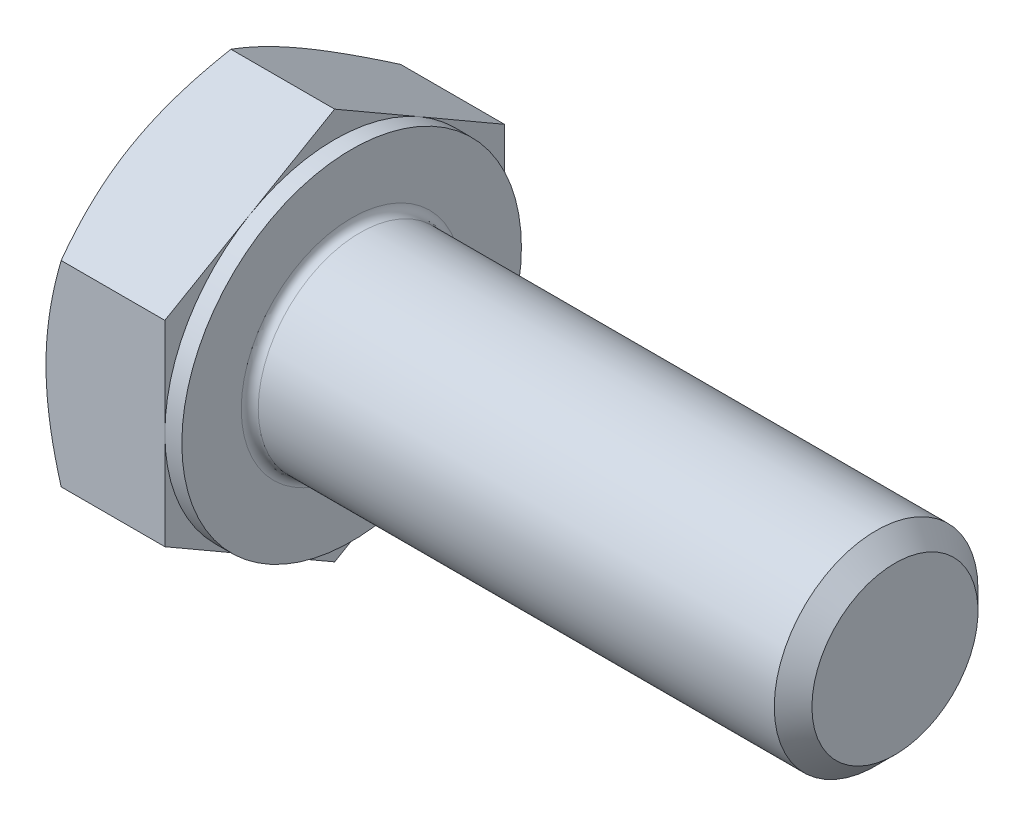
ISO-10303-21;
HEADER;
FILE_DESCRIPTION(('STEP AP214'),'2;1');
FILE_NAME('part.step','',(''),(''),'','','');
FILE_SCHEMA(('AUTOMOTIVE_DESIGN { 1 0 10303 214 1 1 1 1 }'));
ENDSEC;
DATA;
#1=APPLICATION_CONTEXT('core data for automotive mechanical design processes');
#2=APPLICATION_PROTOCOL_DEFINITION('international standard','automotive_design',2000,#1);
#3=PRODUCT_CONTEXT('',#1,'mechanical');
#4=PRODUCT('Part','Part','',(#3));
#5=PRODUCT_RELATED_PRODUCT_CATEGORY('part','',(#4));
#6=PRODUCT_DEFINITION_FORMATION('','',#4);
#7=PRODUCT_DEFINITION_CONTEXT('part definition',#1,'design');
#8=PRODUCT_DEFINITION('design','',#6,#7);
#9=PRODUCT_DEFINITION_SHAPE('','',#8);
#10=(LENGTH_UNIT() NAMED_UNIT(*) SI_UNIT(.MILLI.,.METRE.));
#11=(NAMED_UNIT(*) PLANE_ANGLE_UNIT() SI_UNIT($,.RADIAN.));
#12=(NAMED_UNIT(*) SI_UNIT($,.STERADIAN.) SOLID_ANGLE_UNIT());
#13=UNCERTAINTY_MEASURE_WITH_UNIT(LENGTH_MEASURE(1.E-05),#10,'distance_accuracy_value','');
#14=(GEOMETRIC_REPRESENTATION_CONTEXT(3) GLOBAL_UNCERTAINTY_ASSIGNED_CONTEXT((#13)) GLOBAL_UNIT_ASSIGNED_CONTEXT((#10,
#11,#12)) REPRESENTATION_CONTEXT('',''));
#15=CARTESIAN_POINT('',(0.,0.,0.));
#16=DIRECTION('',(0.,0.,1.));
#17=DIRECTION('',(1.,0.,0.));
#18=AXIS2_PLACEMENT_3D('',#15,#16,#17);
#19=CARTESIAN_POINT('',(4.,0.,-9.99999999999999));
#20=DIRECTION('',(1.,0.,0.));
#21=DIRECTION('',(0.,0.,-1.));
#22=AXIS2_PLACEMENT_3D('',#19,#20,#21);
#23=PLANE('',#22);
#24=CARTESIAN_POINT('',(4.,0.,0.));
#25=DIRECTION('',(1.,0.,0.));
#26=DIRECTION('',(0.,0.,-1.));
#27=AXIS2_PLACEMENT_3D('',#24,#25,#26);
#28=CIRCLE('',#27,3.25);
#29=CARTESIAN_POINT('',(4.,0.,-3.25));
#30=VERTEX_POINT('',#29);
#31=EDGE_CURVE('E43',#30,#30,#28,.F.);
#32=ORIENTED_EDGE('',*,*,#31,.T.);
#33=EDGE_LOOP('',(#32));
#34=FACE_BOUND('',#33,.T.);
#35=CARTESIAN_POINT('',(4.,0.,0.));
#36=DIRECTION('',(1.,0.,0.));
#37=DIRECTION('',(0.,0.,-1.));
#38=AXIS2_PLACEMENT_3D('',#35,#36,#37);
#39=CIRCLE('',#38,5.);
#40=CARTESIAN_POINT('',(4.,0.,-5.));
#41=VERTEX_POINT('',#40);
#42=EDGE_CURVE('E256',#41,#41,#39,.T.);
#43=ORIENTED_EDGE('',*,*,#42,.T.);
#44=EDGE_LOOP('',(#43));
#45=FACE_BOUND('',#44,.T.);
#46=ADVANCED_FACE('F34',(#34,#45),#23,.T.);
#47=CARTESIAN_POINT('',(0.,0.,0.));
#48=DIRECTION('',(-1.,0.,0.));
#49=DIRECTION('',(0.,0.,1.));
#50=AXIS2_PLACEMENT_3D('',#47,#48,#49);
#51=CYLINDRICAL_SURFACE('',#50,3.);
#52=CARTESIAN_POINT('',(4.25,0.,0.));
#53=DIRECTION('',(1.,0.,0.));
#54=DIRECTION('',(0.,0.,-1.));
#55=AXIS2_PLACEMENT_3D('',#52,#53,#54);
#56=CIRCLE('',#55,3.);
#57=CARTESIAN_POINT('',(4.25,0.,-3.));
#58=VERTEX_POINT('',#57);
#59=EDGE_CURVE('E11',#58,#58,#56,.T.);
#60=ORIENTED_EDGE('',*,*,#59,.T.);
#61=EDGE_LOOP('',(#60));
#62=FACE_BOUND('',#61,.T.);
#63=CARTESIAN_POINT('',(19.4455,0.,0.));
#64=DIRECTION('',(-1.,0.,0.));
#65=DIRECTION('',(0.,0.,1.));
#66=AXIS2_PLACEMENT_3D('',#63,#64,#65);
#67=CIRCLE('',#66,3.);
#68=CARTESIAN_POINT('',(19.4455,0.,3.));
#69=VERTEX_POINT('',#68);
#70=EDGE_CURVE('E300',#69,#69,#67,.T.);
#71=ORIENTED_EDGE('',*,*,#70,.T.);
#72=EDGE_LOOP('',(#71));
#73=FACE_BOUND('',#72,.T.);
#74=ADVANCED_FACE('F243',(#62,#73),#51,.T.);
#75=CARTESIAN_POINT('',(20.,0.,0.));
#76=DIRECTION('',(-1.,0.,0.));
#77=DIRECTION('',(0.,0.,1.));
#78=AXIS2_PLACEMENT_3D('',#75,#76,#77);
#79=CONICAL_SURFACE('',#78,2.4455,0.785398163397449);
#80=ORIENTED_EDGE('',*,*,#70,.F.);
#81=EDGE_LOOP('',(#80));
#82=FACE_BOUND('',#81,.T.);
#83=CARTESIAN_POINT('',(20.,0.,0.));
#84=DIRECTION('',(-1.,0.,0.));
#85=DIRECTION('',(0.,0.,1.));
#86=AXIS2_PLACEMENT_3D('',#83,#84,#85);
#87=CIRCLE('',#86,2.4455);
#88=CARTESIAN_POINT('',(20.,0.,2.4455));
#89=VERTEX_POINT('',#88);
#90=EDGE_CURVE('E302',#89,#89,#87,.T.);
#91=ORIENTED_EDGE('',*,*,#90,.T.);
#92=EDGE_LOOP('',(#91));
#93=FACE_BOUND('',#92,.T.);
#94=ADVANCED_FACE('F248',(#82,#93),#79,.T.);
#95=CARTESIAN_POINT('',(20.,0.,0.));
#96=DIRECTION('',(-1.,0.,0.));
#97=DIRECTION('',(0.,0.,1.));
#98=AXIS2_PLACEMENT_3D('',#95,#96,#97);
#99=PLANE('',#98);
#100=ORIENTED_EDGE('',*,*,#90,.F.);
#101=EDGE_LOOP('',(#100));
#102=FACE_BOUND('',#101,.T.);
#103=ADVANCED_FACE('F349',(#102),#99,.F.);
#104=CARTESIAN_POINT('',(3.5,5.,0.));
#105=DIRECTION('',(1.,0.,0.));
#106=DIRECTION('',(0.,0.,-1.));
#107=AXIS2_PLACEMENT_3D('',#104,#105,#106);
#108=PLANE('',#107);
#109=DIRECTION('',(0.,0.500000000000001,0.866025403784438));
#110=VECTOR('',#109,1.);
#111=CARTESIAN_POINT('',(3.5,2.88675134594813,-5.));
#112=LINE('',#111,#110);
#113=CARTESIAN_POINT('',(3.5,2.88675134594813,-5.));
#114=VERTEX_POINT('',#113);
#115=CARTESIAN_POINT('',(3.5,4.33012701892219,-2.50000000000001));
#116=VERTEX_POINT('',#115);
#117=EDGE_CURVE('E167',#114,#116,#112,.T.);
#118=ORIENTED_EDGE('',*,*,#117,.T.);
#119=CARTESIAN_POINT('',(3.5,0.,0.));
#120=DIRECTION('',(-1.,0.,0.));
#121=DIRECTION('',(0.,0.,1.));
#122=AXIS2_PLACEMENT_3D('',#119,#120,#121);
#123=CIRCLE('',#122,5.);
#124=CARTESIAN_POINT('',(3.5,0.,-5.));
#125=VERTEX_POINT('',#124);
#126=EDGE_CURVE('E50',#116,#125,#123,.T.);
#127=ORIENTED_EDGE('',*,*,#126,.T.);
#128=DIRECTION('',(0.,1.,0.));
#129=VECTOR('',#128,1.);
#130=CARTESIAN_POINT('',(3.5,2.88675134594813,-5.));
#131=LINE('',#130,#129);
#132=EDGE_CURVE('E257',#125,#114,#131,.T.);
#133=ORIENTED_EDGE('',*,*,#132,.T.);
#134=EDGE_LOOP('',(#118,#127,#133));
#135=FACE_BOUND('',#134,.T.);
#136=ADVANCED_FACE('F279',(#135),#108,.T.);
#137=CARTESIAN_POINT('',(3.5,5.77350269189626,0.));
#138=VERTEX_POINT('',#137);
#139=EDGE_CURVE('E165',#116,#138,#112,.T.);
#140=ORIENTED_EDGE('',*,*,#139,.T.);
#141=DIRECTION('',(0.,-0.500000000000001,0.866025403784438));
#142=VECTOR('',#141,1.);
#143=CARTESIAN_POINT('',(3.5,5.77350269189626,0.));
#144=LINE('',#143,#142);
#145=CARTESIAN_POINT('',(3.5,4.33012701892219,2.50000000000001));
#146=VERTEX_POINT('',#145);
#147=EDGE_CURVE('E164',#138,#146,#144,.T.);
#148=ORIENTED_EDGE('',*,*,#147,.T.);
#149=EDGE_CURVE('E153',#146,#116,#123,.T.);
#150=ORIENTED_EDGE('',*,*,#149,.T.);
#151=EDGE_LOOP('',(#140,#148,#150));
#152=FACE_BOUND('',#151,.T.);
#153=ADVANCED_FACE('F286',(#152),#108,.T.);
#154=CARTESIAN_POINT('',(3.5,2.88675134594813,5.));
#155=VERTEX_POINT('',#154);
#156=EDGE_CURVE('E132',#146,#155,#144,.T.);
#157=ORIENTED_EDGE('',*,*,#156,.T.);
#158=DIRECTION('',(0.,-1.,0.));
#159=VECTOR('',#158,1.);
#160=CARTESIAN_POINT('',(3.5,2.88675134594813,5.));
#161=LINE('',#160,#159);
#162=CARTESIAN_POINT('',(3.5,0.,5.));
#163=VERTEX_POINT('',#162);
#164=EDGE_CURVE('E126',#155,#163,#161,.T.);
#165=ORIENTED_EDGE('',*,*,#164,.T.);
#166=EDGE_CURVE('E130',#163,#146,#123,.T.);
#167=ORIENTED_EDGE('',*,*,#166,.T.);
#168=EDGE_LOOP('',(#157,#165,#167));
#169=FACE_BOUND('',#168,.T.);
#170=ADVANCED_FACE('F128',(#169),#108,.T.);
#171=CARTESIAN_POINT('',(3.5,-2.88675134594814,5.));
#172=VERTEX_POINT('',#171);
#173=EDGE_CURVE('E136',#163,#172,#161,.T.);
#174=ORIENTED_EDGE('',*,*,#173,.T.);
#175=DIRECTION('',(0.,-0.500000000000001,-0.866025403784438));
#176=VECTOR('',#175,1.);
#177=CARTESIAN_POINT('',(3.5,-5.77350269189627,0.));
#178=LINE('',#177,#176);
#179=CARTESIAN_POINT('',(3.5,-4.33012701892219,2.50000000000001));
#180=VERTEX_POINT('',#179);
#181=EDGE_CURVE('E143',#172,#180,#178,.T.);
#182=ORIENTED_EDGE('',*,*,#181,.T.);
#183=EDGE_CURVE('E140',#180,#163,#123,.T.);
#184=ORIENTED_EDGE('',*,*,#183,.T.);
#185=EDGE_LOOP('',(#174,#182,#184));
#186=FACE_BOUND('',#185,.T.);
#187=ADVANCED_FACE('F141',(#186),#108,.T.);
#188=CARTESIAN_POINT('',(3.5,-5.77350269189627,0.));
#189=VERTEX_POINT('',#188);
#190=EDGE_CURVE('E159',#180,#189,#178,.T.);
#191=ORIENTED_EDGE('',*,*,#190,.T.);
#192=DIRECTION('',(0.,0.500000000000001,-0.866025403784438));
#193=VECTOR('',#192,1.);
#194=CARTESIAN_POINT('',(3.5,-2.88675134594814,-5.));
#195=LINE('',#194,#193);
#196=CARTESIAN_POINT('',(3.5,-4.33012701892219,-2.50000000000001));
#197=VERTEX_POINT('',#196);
#198=EDGE_CURVE('E340',#189,#197,#195,.T.);
#199=ORIENTED_EDGE('',*,*,#198,.T.);
#200=EDGE_CURVE('E147',#197,#180,#123,.T.);
#201=ORIENTED_EDGE('',*,*,#200,.T.);
#202=EDGE_LOOP('',(#191,#199,#201));
#203=FACE_BOUND('',#202,.T.);
#204=ADVANCED_FACE('F341',(#203),#108,.T.);
#205=CARTESIAN_POINT('',(3.5,-2.88675134594814,-5.));
#206=VERTEX_POINT('',#205);
#207=EDGE_CURVE('E154',#197,#206,#195,.T.);
#208=ORIENTED_EDGE('',*,*,#207,.T.);
#209=EDGE_CURVE('E260',#206,#125,#131,.T.);
#210=ORIENTED_EDGE('',*,*,#209,.T.);
#211=EDGE_CURVE('E272',#125,#197,#123,.T.);
#212=ORIENTED_EDGE('',*,*,#211,.T.);
#213=EDGE_LOOP('',(#208,#210,#212));
#214=FACE_BOUND('',#213,.T.);
#215=ADVANCED_FACE('F271',(#214),#108,.T.);
#216=CARTESIAN_POINT('',(0.,0.,0.));
#217=DIRECTION('',(-1.,0.,0.));
#218=DIRECTION('',(0.,0.,1.));
#219=AXIS2_PLACEMENT_3D('',#216,#217,#218);
#220=CYLINDRICAL_SURFACE('',#219,5.);
#221=ORIENTED_EDGE('',*,*,#126,.F.);
#222=ORIENTED_EDGE('',*,*,#149,.F.);
#223=ORIENTED_EDGE('',*,*,#166,.F.);
#224=ORIENTED_EDGE('',*,*,#183,.F.);
#225=ORIENTED_EDGE('',*,*,#200,.F.);
#226=ORIENTED_EDGE('',*,*,#211,.F.);
#227=EDGE_LOOP('',(#221,#222,#223,#224,#225,#226));
#228=FACE_BOUND('',#227,.T.);
#229=ORIENTED_EDGE('',*,*,#42,.F.);
#230=EDGE_LOOP('',(#229));
#231=FACE_BOUND('',#230,.T.);
#232=ADVANCED_FACE('F150',(#228,#231),#220,.T.);
#233=CARTESIAN_POINT('',(0.,0.,-9.99999999999999));
#234=DIRECTION('',(1.,0.,0.));
#235=DIRECTION('',(0.,0.,-1.));
#236=AXIS2_PLACEMENT_3D('',#233,#234,#235);
#237=PLANE('',#236);
#238=CARTESIAN_POINT('',(0.,0.,0.));
#239=DIRECTION('',(1.,0.,0.));
#240=DIRECTION('',(0.,0.,-1.));
#241=AXIS2_PLACEMENT_3D('',#238,#239,#240);
#242=CIRCLE('',#241,5.);
#243=CARTESIAN_POINT('',(0.,0.,-5.));
#244=VERTEX_POINT('',#243);
#245=CARTESIAN_POINT('',(0.,4.33012701892219,-2.50000000000001));
#246=VERTEX_POINT('',#245);
#247=EDGE_CURVE('E258',#244,#246,#242,.T.);
#248=ORIENTED_EDGE('',*,*,#247,.F.);
#249=CARTESIAN_POINT('',(0.,-4.33012701892219,-2.50000000000001));
#250=VERTEX_POINT('',#249);
#251=EDGE_CURVE('E264',#250,#244,#242,.T.);
#252=ORIENTED_EDGE('',*,*,#251,.F.);
#253=CARTESIAN_POINT('',(0.,-4.33012701892219,2.5));
#254=VERTEX_POINT('',#253);
#255=EDGE_CURVE('E322',#254,#250,#242,.T.);
#256=ORIENTED_EDGE('',*,*,#255,.F.);
#257=CARTESIAN_POINT('',(0.,0.,5.));
#258=VERTEX_POINT('',#257);
#259=EDGE_CURVE('E318',#258,#254,#242,.T.);
#260=ORIENTED_EDGE('',*,*,#259,.F.);
#261=CARTESIAN_POINT('',(0.,0.,0.));
#262=DIRECTION('',(-1.,0.,0.));
#263=DIRECTION('',(0.,0.,1.));
#264=AXIS2_PLACEMENT_3D('',#261,#262,#263);
#265=CIRCLE('',#264,5.);
#266=CARTESIAN_POINT('',(0.,4.33012701892219,2.50000000000001));
#267=VERTEX_POINT('',#266);
#268=EDGE_CURVE('E168',#258,#267,#265,.T.);
#269=ORIENTED_EDGE('',*,*,#268,.T.);
#270=EDGE_CURVE('E262',#246,#267,#242,.T.);
#271=ORIENTED_EDGE('',*,*,#270,.F.);
#272=EDGE_LOOP('',(#248,#252,#256,#260,#269,#271));
#273=FACE_BOUND('',#272,.T.);
#274=ADVANCED_FACE('F319',(#273),#237,.F.);
#275=CARTESIAN_POINT('',(0.,0.,0.));
#276=DIRECTION('',(1.,0.,0.));
#277=DIRECTION('',(0.,0.,-1.));
#278=AXIS2_PLACEMENT_3D('',#275,#276,#277);
#279=CONICAL_SURFACE('',#278,5.,1.0471975511966);
#280=CARTESIAN_POINT('',(0.446648656051824,2.88663587589429,5.0002));
#281=CARTESIAN_POINT('',(0.373386567637631,3.01349970319368,4.78046540547482));
#282=CARTESIAN_POINT('',(0.306751321918088,3.14144859993849,4.55885141554042));
#283=CARTESIAN_POINT('',(0.190438991010809,3.39956193532121,4.11178600454649));
#284=CARTESIAN_POINT('',(0.140803049915788,3.52973095989718,3.88632664040923));
#285=CARTESIAN_POINT('',(0.0635510254186974,3.78847564779797,3.43816769477649));
#286=CARTESIAN_POINT('',(0.0354203782834891,3.91701101576052,3.21553790689581));
#287=CARTESIAN_POINT('',(0.0101949219536846,4.11026620624322,2.88081009815336));
#288=CARTESIAN_POINT('',(0.00461345976948418,4.17472868879311,2.76915780319494));
#289=CARTESIAN_POINT('',(-0.000797783248529371,4.30371322717528,2.54575002932621));
#290=CARTESIAN_POINT('',(-0.000627741741796153,4.36823528110589,2.43399455370969));
#291=CARTESIAN_POINT('',(0.00775363179203702,4.54500768479194,2.12781576914937));
#292=CARTESIAN_POINT('',(0.021829771897252,4.65719946015292,1.93349391403279));
#293=CARTESIAN_POINT('',(0.0664652571094313,4.88083840557981,1.5461398980023));
#294=CARTESIAN_POINT('',(0.0970398601475086,4.9922847895602,1.35310909862843));
#295=CARTESIAN_POINT('',(0.173468493621164,5.21637431361295,0.964974657525147));
#296=CARTESIAN_POINT('',(0.21964637887868,5.32898917185759,0.769920001358266));
#297=CARTESIAN_POINT('',(0.324451794491934,5.55253939626499,0.382719654641232));
#298=CARTESIAN_POINT('',(0.383054703437373,5.66347762579592,0.190569004591914));
#299=CARTESIAN_POINT('',(0.446648656051828,5.7736181619501,-0.000200000000000293));
#300=B_SPLINE_CURVE_WITH_KNOTS('',3,(#280,#281,#282,#283,#284,#285,#286,#287,#288,#289,#290,
#291,#292,#293,#294,#295,#296,#297,#298,#299),.UNSPECIFIED.,.F.,.F.,(4,2,2,2,2,2,2,2,2,4),(0.,
0.792555841363091,1.58701660053333,2.3618153748728,2.74884076077325,3.13585419177294,
3.80962362599679,4.48401723901189,5.17336882348929,5.86136694793725),.UNSPECIFIED.);
#301=CARTESIAN_POINT('',(0.446581987385201,5.77350269189626,0.));
#302=VERTEX_POINT('',#301);
#303=EDGE_CURVE('E214',#267,#302,#300,.T.);
#304=ORIENTED_EDGE('',*,*,#303,.T.);
#305=CARTESIAN_POINT('',(0.446648656051827,5.7736181619501,0.000200000000000014));
#306=CARTESIAN_POINT('',(0.373386567637634,5.64675433465071,-0.219534594525185));
#307=CARTESIAN_POINT('',(0.306751321918092,5.5188054379059,-0.44114858445958));
#308=CARTESIAN_POINT('',(0.190438991010811,5.26069210252318,-0.888213995453512));
#309=CARTESIAN_POINT('',(0.14080304991579,5.13052307794721,-1.11367335959077));
#310=CARTESIAN_POINT('',(0.063551025418699,4.87177839004641,-1.56183230522351));
#311=CARTESIAN_POINT('',(0.0354203782834906,4.74324302208387,-1.78446209310419));
#312=CARTESIAN_POINT('',(0.0101949219536853,4.54998783160116,-2.11918990184664));
#313=CARTESIAN_POINT('',(0.00461345976948458,4.48552534905128,-2.23084219680506));
#314=CARTESIAN_POINT('',(-0.000797783248529267,4.35654081066911,-2.4542499706738));
#315=CARTESIAN_POINT('',(-0.000627741741796011,4.2920187567385,-2.56600544629031));
#316=CARTESIAN_POINT('',(0.0077536317920371,4.11524635305244,-2.87218423085064));
#317=CARTESIAN_POINT('',(0.0218297718972518,4.00305457769146,-3.06650608596721));
#318=CARTESIAN_POINT('',(0.0664652571094301,3.77941563226457,-3.4538601019977));
#319=CARTESIAN_POINT('',(0.0970398601475068,3.66796924828418,-3.64689090137157));
#320=CARTESIAN_POINT('',(0.173468493621161,3.44387972423144,-4.03502534247485));
#321=CARTESIAN_POINT('',(0.219646378878677,3.3312648659868,-4.23007999864173));
#322=CARTESIAN_POINT('',(0.324451794491931,3.1077146415794,-4.61728034535877));
#323=CARTESIAN_POINT('',(0.38305470343737,2.99677641204847,-4.80943099540808));
#324=CARTESIAN_POINT('',(0.446648656051823,2.88663587589429,-5.0002));
#325=B_SPLINE_CURVE_WITH_KNOTS('',3,(#305,#306,#307,#308,#309,#310,#311,#312,#313,#314,#315,
#316,#317,#318,#319,#320,#321,#322,#323,#324),.UNSPECIFIED.,.F.,.F.,(4,2,2,2,2,2,2,2,2,4),(0.,
0.79255584136309,1.58701660053333,2.3618153748728,2.74884076077325,3.13585419177295,
3.80962362599679,4.48401723901189,5.17336882348929,5.86136694793725),.UNSPECIFIED.);
#326=EDGE_CURVE('E58',#302,#246,#325,.T.);
#327=ORIENTED_EDGE('',*,*,#326,.T.);
#328=ORIENTED_EDGE('',*,*,#270,.T.);
#329=EDGE_LOOP('',(#304,#327,#328));
#330=FACE_BOUND('',#329,.T.);
#331=ADVANCED_FACE('F316',(#330),#279,.T.);
#332=CARTESIAN_POINT('',(2.47533544773016,-7.82661640485967,5.));
#333=CARTESIAN_POINT('',(2.36879683587999,-7.60758613191209,5.));
#334=CARTESIAN_POINT('',(2.26325911909789,-7.38806071524903,5.));
#335=CARTESIAN_POINT('',(2.05474707935714,-6.9477564968432,5.));
#336=CARTESIAN_POINT('',(1.9517731468329,-6.72697751040762,5.));
#337=CARTESIAN_POINT('',(1.74844778604607,-6.28280027256958,5.));
#338=CARTESIAN_POINT('',(1.64811306546723,-6.05939434718172,5.));
#339=CARTESIAN_POINT('',(1.45145486053268,-5.61083043946536,5.));
#340=CARTESIAN_POINT('',(1.35513119126154,-5.38567253847479,5.));
#341=CARTESIAN_POINT('',(1.16445037644561,-4.92576614875537,5.));
#342=CARTESIAN_POINT('',(1.07026351441088,-4.69094667948418,5.));
#343=CARTESIAN_POINT('',(0.888844387633466,-4.21858752811391,5.));
#344=CARTESIAN_POINT('',(0.801612892890079,-3.98104754815841,5.));
#345=CARTESIAN_POINT('',(0.636341072069419,-3.50329086460758,5.));
#346=CARTESIAN_POINT('',(0.55828276530585,-3.26308044300257,5.));
#347=CARTESIAN_POINT('',(0.413813856838626,-2.77921467855872,5.));
#348=CARTESIAN_POINT('',(0.347399663707796,-2.53556042305535,5.));
#349=CARTESIAN_POINT('',(0.229707450560147,-2.04600448324933,5.));
#350=CARTESIAN_POINT('',(0.178346573443936,-1.80012308688265,5.));
#351=CARTESIAN_POINT('',(0.0936230804633179,-1.305228374755,5.));
#352=CARTESIAN_POINT('',(0.0602585788862655,-1.05621538993015,5.));
#353=CARTESIAN_POINT('',(0.0146229933450854,-0.559584253278236,5.));
#354=CARTESIAN_POINT('',(0.00207498504095138,-0.31199219235864,5.));
#355=CARTESIAN_POINT('',(-0.00159747163599441,0.183375584872584,5.));
#356=CARTESIAN_POINT('',(0.00727849452386911,0.431151304645094,5.));
#357=CARTESIAN_POINT('',(0.0397265054214767,0.849622861805586,5.));
#358=CARTESIAN_POINT('',(0.0579847913857285,1.02075746651638,5.));
#359=CARTESIAN_POINT('',(0.103624050167705,1.36181398870371,5.));
#360=CARTESIAN_POINT('',(0.131006199278085,1.53173574692745,5.));
#361=CARTESIAN_POINT('',(0.225403334084525,2.03942834664788,5.));
#362=CARTESIAN_POINT('',(0.304653621421581,2.37495177296714,5.));
#363=CARTESIAN_POINT('',(0.442611792559001,2.87686006155706,5.));
#364=CARTESIAN_POINT('',(0.492453036342918,3.0458304872064,5.));
#365=CARTESIAN_POINT('',(0.597441969943079,3.38213061181746,5.));
#366=CARTESIAN_POINT('',(0.652589699263441,3.54946029855449,5.));
#367=CARTESIAN_POINT('',(0.767295730539581,3.88253122492364,5.));
#368=CARTESIAN_POINT('',(0.82685271369385,4.04827292290385,5.));
#369=CARTESIAN_POINT('',(0.949663499710998,4.37837269762153,5.));
#370=CARTESIAN_POINT('',(1.01291722698938,4.5427308025697,5.));
#371=CARTESIAN_POINT('',(1.18384085372924,4.97467594201679,5.));
#372=CARTESIAN_POINT('',(1.29410564850766,5.24123504417617,5.));
#373=CARTESIAN_POINT('',(1.5208504127353,5.7717060368554,5.));
#374=CARTESIAN_POINT('',(1.63733099875865,6.03561766166312,5.));
#375=CARTESIAN_POINT('',(1.87507624465413,6.56138078935165,5.));
#376=CARTESIAN_POINT('',(1.99634255400967,6.82323154395422,5.));
#377=CARTESIAN_POINT('',(2.24254703935561,7.34518395756718,5.));
#378=CARTESIAN_POINT('',(2.36748508274945,7.60528567932421,5.));
#379=CARTESIAN_POINT('',(2.62044102963033,8.12446478812679,5.));
#380=CARTESIAN_POINT('',(2.74846325137577,8.38354006704556,5.));
#381=CARTESIAN_POINT('',(3.00682669043527,8.90053291278444,5.));
#382=CARTESIAN_POINT('',(3.1371679315062,9.15845046771047,5.));
#383=CARTESIAN_POINT('',(3.53092424668021,9.93067662423608,5.));
#384=CARTESIAN_POINT('',(3.79712405249167,10.443564725279,5.));
#385=CARTESIAN_POINT('',(4.30724046958686,11.4147548726185,5.));
#386=CARTESIAN_POINT('',(4.55067498840221,11.8733113497711,5.));
#387=CARTESIAN_POINT('',(5.04052915864102,12.7888590482936,5.));
#388=CARTESIAN_POINT('',(5.28694897561914,13.2458501810352,5.));
#389=CARTESIAN_POINT('',(5.78122505426356,14.1571829404852,5.));
#390=CARTESIAN_POINT('',(6.02907430541541,14.6115283754435,5.));
#391=CARTESIAN_POINT('',(6.52648185600864,15.519239876133,5.));
#392=CARTESIAN_POINT('',(6.77604002891257,15.9726060111757,5.));
#393=CARTESIAN_POINT('',(7.02622264640792,16.4256251058944,5.));
#394=B_SPLINE_CURVE_WITH_KNOTS('',3,(#332,#333,#334,#335,#336,#337,#338,#339,#340,#341,#342,
#343,#344,#345,#346,#347,#348,#349,#350,#351,#352,#353,#354,#355,#356,#357,#358,#359,#360,#361,
#362,#363,#364,#365,#366,#367,#368,#369,#370,#371,#372,#373,#374,#375,#376,#377,#378,#379,#380,
#381,#382,#383,#384,#385,#386,#387,#388,#389,#390,#391,#392,#393),.UNSPECIFIED.,.F.,.F.,(4,2,2,
2,2,2,2,2,2,2,2,2,2,2,2,2,2,2,2,2,2,2,2,2,2,2,2,2,2,2,4),(0.,0.730708682345172,1.46152797074168,
2.19620403713772,2.93084619629068,3.6897749176122,4.44878754040521,5.20628666357256,
5.96355173652935,6.71656679685729,7.4695029387385,8.21233991499824,8.95519126453255,
9.47125991534871,9.98739512599665,11.0201893970363,11.5486465448551,12.0771076270762,
12.6054112809943,13.1337041368682,13.9989833756253,14.8643486057044,15.7300147495654,
16.5956496701284,17.4625765104337,18.329512236973,20.0630293199506,21.6205191254926,
23.178095703244,24.7307447740736,26.2832800957379),.UNSPECIFIED.);
#395=CARTESIAN_POINT('',(0.446581987385197,2.88675134594813,5.));
#396=VERTEX_POINT('',#395);
#397=EDGE_CURVE('E226',#258,#396,#394,.T.);
#398=ORIENTED_EDGE('',*,*,#397,.T.);
#399=EDGE_CURVE('E225',#396,#267,#300,.T.);
#400=ORIENTED_EDGE('',*,*,#399,.T.);
#401=ORIENTED_EDGE('',*,*,#268,.F.);
#402=EDGE_LOOP('',(#398,#400,#401));
#403=FACE_BOUND('',#402,.T.);
#404=ADVANCED_FACE('F313',(#403),#279,.T.);
#405=CARTESIAN_POINT('',(0.446581987385201,-2.88675134594814,5.));
#406=VERTEX_POINT('',#405);
#407=EDGE_CURVE('E304',#406,#258,#394,.T.);
#408=ORIENTED_EDGE('',*,*,#407,.T.);
#409=ORIENTED_EDGE('',*,*,#259,.T.);
#410=CARTESIAN_POINT('',(0.446648656051833,-5.77361816195011,-0.000200000000000132));
#411=CARTESIAN_POINT('',(0.37338656763764,-5.64675433465072,0.219534594525185));
#412=CARTESIAN_POINT('',(0.306751321918097,-5.51880543790591,0.441148584459581));
#413=CARTESIAN_POINT('',(0.190438991010817,-5.26069210252319,0.888213995453514));
#414=CARTESIAN_POINT('',(0.140803049915795,-5.13052307794722,1.11367335959078));
#415=CARTESIAN_POINT('',(0.0635510254187042,-4.87177839004642,1.56183230522351));
#416=CARTESIAN_POINT('',(0.0354203782834959,-4.74324302208388,1.7844620931042));
#417=CARTESIAN_POINT('',(0.0101949219536907,-4.54998783160117,2.11918990184664));
#418=CARTESIAN_POINT('',(0.00461345976948994,-4.48552534905129,2.23084219680506));
#419=CARTESIAN_POINT('',(-0.000797783248523865,-4.35654081066912,2.4542499706738));
#420=CARTESIAN_POINT('',(-0.000627741741790524,-4.29201875673851,2.56600544629032));
#421=CARTESIAN_POINT('',(0.00775363179204263,-4.11524635305245,2.87218423085064));
#422=CARTESIAN_POINT('',(0.0218297718972571,-4.00305457769147,3.06650608596722));
#423=CARTESIAN_POINT('',(0.0664652571094352,-3.77941563226458,3.45386010199771));
#424=CARTESIAN_POINT('',(0.0970398601475118,-3.66796924828419,3.64689090137157));
#425=CARTESIAN_POINT('',(0.173468493621166,-3.44387972423145,4.03502534247486));
#426=CARTESIAN_POINT('',(0.219646378878682,-3.33126486598681,4.23007999864174));
#427=CARTESIAN_POINT('',(0.324451794491934,-3.10771464157941,4.61728034535877));
#428=CARTESIAN_POINT('',(0.383054703437374,-2.99677641204848,4.80943099540809));
#429=CARTESIAN_POINT('',(0.446648656051827,-2.8866358758943,5.0002));
#430=B_SPLINE_CURVE_WITH_KNOTS('',3,(#410,#411,#412,#413,#414,#415,#416,#417,#418,#419,#420,
#421,#422,#423,#424,#425,#426,#427,#428,#429),.UNSPECIFIED.,.F.,.F.,(4,2,2,2,2,2,2,2,2,4),(0.,
0.792555841363091,1.58701660053334,2.36181537487281,2.74884076077326,3.13585419177295,
3.8096236259968,4.4840172390119,5.17336882348929,5.86136694793726),.UNSPECIFIED.);
#431=EDGE_CURVE('E216',#254,#406,#430,.T.);
#432=ORIENTED_EDGE('',*,*,#431,.T.);
#433=EDGE_LOOP('',(#408,#409,#432));
#434=FACE_BOUND('',#433,.T.);
#435=ADVANCED_FACE('F186',(#434),#279,.T.);
#436=CARTESIAN_POINT('',(0.446581987385207,-5.77350269189627,0.));
#437=VERTEX_POINT('',#436);
#438=EDGE_CURVE('E209',#437,#254,#430,.T.);
#439=ORIENTED_EDGE('',*,*,#438,.T.);
#440=ORIENTED_EDGE('',*,*,#255,.T.);
#441=CARTESIAN_POINT('',(0.446648656051826,-2.8866358758943,-5.0002));
#442=CARTESIAN_POINT('',(0.373386567637633,-3.01349970319369,-4.78046540547481));
#443=CARTESIAN_POINT('',(0.306751321918091,-3.1414485999385,-4.55885141554042));
#444=CARTESIAN_POINT('',(0.190438991010811,-3.39956193532122,-4.11178600454649));
#445=CARTESIAN_POINT('',(0.14080304991579,-3.52973095989719,-3.88632664040923));
#446=CARTESIAN_POINT('',(0.0635510254187011,-3.78847564779798,-3.43816769477649));
#447=CARTESIAN_POINT('',(0.0354203782834932,-3.91701101576053,-3.21553790689581));
#448=CARTESIAN_POINT('',(0.0101949219536891,-4.11026620624323,-2.88081009815336));
#449=CARTESIAN_POINT('',(0.00461345976948878,-4.17472868879312,-2.76915780319494));
#450=CARTESIAN_POINT('',(-0.00079778324852446,-4.30371322717529,-2.5457500293262));
#451=CARTESIAN_POINT('',(-0.000627741741791005,-4.3682352811059,-2.43399455370969));
#452=CARTESIAN_POINT('',(0.0077536317920428,-4.54500768479195,-2.12781576914936));
#453=CARTESIAN_POINT('',(0.0218297718972581,-4.65719946015294,-1.93349391403279));
#454=CARTESIAN_POINT('',(0.0664652571094377,-4.88083840557983,-1.54613989800229));
#455=CARTESIAN_POINT('',(0.0970398601475149,-4.99228478956022,-1.35310909862843));
#456=CARTESIAN_POINT('',(0.17346849362117,-5.21637431361296,-0.964974657525145));
#457=CARTESIAN_POINT('',(0.219646378878686,-5.3289891718576,-0.769920001358264));
#458=CARTESIAN_POINT('',(0.324451794491939,-5.552539396265,-0.382719654641231));
#459=CARTESIAN_POINT('',(0.383054703437379,-5.66347762579593,-0.190569004591913));
#460=CARTESIAN_POINT('',(0.446648656051833,-5.77361816195011,0.000200000000000131));
#461=B_SPLINE_CURVE_WITH_KNOTS('',3,(#441,#442,#443,#444,#445,#446,#447,#448,#449,#450,#451,
#452,#453,#454,#455,#456,#457,#458,#459,#460),.UNSPECIFIED.,.F.,.F.,(4,2,2,2,2,2,2,2,2,4),(0.,
0.792555841363091,1.58701660053333,2.3618153748728,2.74884076077325,3.13585419177295,
3.80962362599679,4.48401723901189,5.17336882348929,5.86136694793725),.UNSPECIFIED.);
#462=EDGE_CURVE('E215',#250,#437,#461,.T.);
#463=ORIENTED_EDGE('',*,*,#462,.T.);
#464=EDGE_LOOP('',(#439,#440,#463));
#465=FACE_BOUND('',#464,.T.);
#466=ADVANCED_FACE('F336',(#465),#279,.T.);
#467=CARTESIAN_POINT('',(0.446581987385197,2.88675134594813,-5.));
#468=VERTEX_POINT('',#467);
#469=EDGE_CURVE('E217',#246,#468,#325,.T.);
#470=ORIENTED_EDGE('',*,*,#469,.T.);
#471=CARTESIAN_POINT('',(2.47533544689294,-7.82661640313891,-5.));
#472=CARTESIAN_POINT('',(2.36879683507771,-7.60758613024923,-5.));
#473=CARTESIAN_POINT('',(2.26325911833055,-7.38806071364411,-5.));
#474=CARTESIAN_POINT('',(2.05474707865949,-6.94775649535434,-5.));
#475=CARTESIAN_POINT('',(1.95177314617001,-6.72697750897689,-5.));
#476=CARTESIAN_POINT('',(1.74844778545274,-6.28280027125598,-5.));
#477=CARTESIAN_POINT('',(1.64811306490868,-6.05939434592714,-5.));
#478=CARTESIAN_POINT('',(1.45145486004311,-5.61083043832921,-5.));
#479=CARTESIAN_POINT('',(1.35513119080616,-5.38567253739806,-5.));
#480=CARTESIAN_POINT('',(1.1644503760596,-4.92576614780203,-5.));
#481=CARTESIAN_POINT('',(1.07026351405995,-4.69094667859486,-5.));
#482=CARTESIAN_POINT('',(0.888844387350833,-4.21858752735363,-5.));
#483=CARTESIAN_POINT('',(0.801612892640655,-3.98104754746318,-5.));
#484=CARTESIAN_POINT('',(0.636341071883236,-3.50329086404364,-5.));
#485=CARTESIAN_POINT('',(0.558282765149708,-3.26308044250488,-5.));
#486=CARTESIAN_POINT('',(0.413813856737664,-2.77921467819532,-5.));
#487=CARTESIAN_POINT('',(0.347399663631974,-2.53556042276,-5.));
#488=CARTESIAN_POINT('',(0.229707450535051,-2.04600448312504,-5.));
#489=CARTESIAN_POINT('',(0.178346573442478,-1.80012308686184,-5.));
#490=CARTESIAN_POINT('',(0.0936230804935148,-1.30522837494366,-5.));
#491=CARTESIAN_POINT('',(0.0602585789244923,-1.05621539022478,-5.));
#492=CARTESIAN_POINT('',(0.0146229933804845,-0.559584253783077,-5.));
#493=CARTESIAN_POINT('',(0.00207498506584101,-0.311992192967685,-5.));
#494=CARTESIAN_POINT('',(-0.00159747165030565,0.183375584056728,-5.));
#495=CARTESIAN_POINT('',(0.00727849448086162,0.431151303726631,-5.));
#496=CARTESIAN_POINT('',(0.0397265053205825,0.849622860758219,-5.));
#497=CARTESIAN_POINT('',(0.0579847912618776,1.02075746544156,-5.));
#498=CARTESIAN_POINT('',(0.10362404999672,1.36181398757519,-5.));
#499=CARTESIAN_POINT('',(0.131006199082922,1.5317357457727,-5.));
#500=CARTESIAN_POINT('',(0.225403333816321,2.03942834541587,-5.));
#501=CARTESIAN_POINT('',(0.304653621104035,2.37495177168564,-5.));
#502=CARTESIAN_POINT('',(0.442611792168638,2.87686006020152,-5.));
#503=CARTESIAN_POINT('',(0.492453035928115,3.04583048582566,-5.));
#504=CARTESIAN_POINT('',(0.59744196948014,3.3821306103866,-5.));
#505=CARTESIAN_POINT('',(0.652589698776805,3.54946029709871,-5.));
#506=CARTESIAN_POINT('',(0.767295730006396,3.88253122341819,-5.));
#507=CARTESIAN_POINT('',(0.826852713137815,4.04827292137366,-5.));
#508=CARTESIAN_POINT('',(0.949663499110051,4.37837269604185,-5.));
#509=CARTESIAN_POINT('',(1.01291722636637,4.54273080096528,-5.));
#510=CARTESIAN_POINT('',(1.18384085306905,4.97467594039772,-5.));
#511=CARTESIAN_POINT('',(1.29410564783453,5.2412350425665,-5.));
#512=CARTESIAN_POINT('',(1.52085041203992,5.77170603526337,-5.));
#513=CARTESIAN_POINT('',(1.63733099805396,6.03561766007931,-5.));
#514=CARTESIAN_POINT('',(1.87507624393348,6.5613807877834,-5.));
#515=CARTESIAN_POINT('',(1.99634255328237,6.82323154239331,-5.));
#516=CARTESIAN_POINT('',(2.24254703861692,7.34518395602018,-5.));
#517=CARTESIAN_POINT('',(2.36748508200601,7.60528567778377,-5.));
#518=CARTESIAN_POINT('',(2.62044102887897,8.12446478659925,-5.));
#519=CARTESIAN_POINT('',(2.74846325062125,8.38354006552435,-5.));
#520=CARTESIAN_POINT('',(3.00682668967548,8.90053291127543,-5.));
#521=CARTESIAN_POINT('',(3.13716793074431,9.15845046620732,-5.));
#522=CARTESIAN_POINT('',(3.53092424591315,9.93067662274982,-5.));
#523=CARTESIAN_POINT('',(3.79712405172273,10.4435647238032,-5.));
#524=CARTESIAN_POINT('',(4.30724046881168,11.4147548711532,-5.));
#525=CARTESIAN_POINT('',(4.55067498762243,11.873311348306,-5.));
#526=CARTESIAN_POINT('',(5.04052915785296,12.7888590468284,-5.));
#527=CARTESIAN_POINT('',(5.28694897482741,13.2458501795697,-5.));
#528=CARTESIAN_POINT('',(5.78122505346437,14.1571829390174,-5.));
#529=CARTESIAN_POINT('',(6.02907430461242,14.6115283739736,-5.));
#530=CARTESIAN_POINT('',(6.52648185519848,15.5192398746589,-5.));
#531=CARTESIAN_POINT('',(6.77604002809904,15.9726060096993,-5.));
#532=CARTESIAN_POINT('',(7.02622264559115,16.4256251044156,-5.));
#533=B_SPLINE_CURVE_WITH_KNOTS('',3,(#471,#472,#473,#474,#475,#476,#477,#478,#479,#480,#481,
#482,#483,#484,#485,#486,#487,#488,#489,#490,#491,#492,#493,#494,#495,#496,#497,#498,#499,#500,
#501,#502,#503,#504,#505,#506,#507,#508,#509,#510,#511,#512,#513,#514,#515,#516,#517,#518,#519,
#520,#521,#522,#523,#524,#525,#526,#527,#528,#529,#530,#531,#532),.UNSPECIFIED.,.F.,.F.,(4,2,2,
2,2,2,2,2,2,2,2,2,2,2,2,2,2,2,2,2,2,2,2,2,2,2,2,2,2,2,4),(0.,0.730708682143098,1.4615279703375,
2.19620403652928,2.930846195478,3.68977491658213,4.44878753915767,5.20628666210827,
5.96355173484849,6.71656679485871,7.46950293642267,8.21233991237299,8.95519126159773,
9.47125991232469,9.98739512288342,11.0201893937443,11.5486465414698,12.0771076235976,
12.6054112774226,13.1337041332035,13.9989833719716,14.864348602062,15.7300147459346,
16.5956496665092,17.4625765068272,18.3295122333794,20.0630293163822,21.6205191219182,
23.1780956996636,24.7307447704824,26.2832800921359),.UNSPECIFIED.);
#534=EDGE_CURVE('E179',#468,#244,#533,.F.);
#535=ORIENTED_EDGE('',*,*,#534,.T.);
#536=ORIENTED_EDGE('',*,*,#247,.T.);
#537=EDGE_LOOP('',(#470,#535,#536));
#538=FACE_BOUND('',#537,.T.);
#539=ADVANCED_FACE('F333',(#538),#279,.T.);
#540=CARTESIAN_POINT('',(0.446581987384945,-2.88675134594852,-5.));
#541=VERTEX_POINT('',#540);
#542=EDGE_CURVE('E180',#541,#250,#461,.T.);
#543=ORIENTED_EDGE('',*,*,#542,.T.);
#544=ORIENTED_EDGE('',*,*,#251,.T.);
#545=EDGE_CURVE('E171',#244,#541,#533,.F.);
#546=ORIENTED_EDGE('',*,*,#545,.T.);
#547=EDGE_LOOP('',(#543,#544,#546));
#548=FACE_BOUND('',#547,.T.);
#549=ADVANCED_FACE('F195',(#548),#279,.T.);
#550=CARTESIAN_POINT('',(4.,2.88675134594813,-5.));
#551=DIRECTION('',(0.,0.,1.));
#552=DIRECTION('',(1.,0.,0.));
#553=AXIS2_PLACEMENT_3D('',#550,#551,#552);
#554=PLANE('',#553);
#555=ORIENTED_EDGE('',*,*,#209,.F.);
#556=DIRECTION('',(-1.,0.,0.));
#557=VECTOR('',#556,1.);
#558=CARTESIAN_POINT('',(4.,-2.88675134594814,-5.));
#559=LINE('',#558,#557);
#560=EDGE_CURVE('E297',#206,#541,#559,.T.);
#561=ORIENTED_EDGE('',*,*,#560,.T.);
#562=ORIENTED_EDGE('',*,*,#545,.F.);
#563=ORIENTED_EDGE('',*,*,#534,.F.);
#564=DIRECTION('',(-1.,0.,0.));
#565=VECTOR('',#564,1.);
#566=CARTESIAN_POINT('',(4.,2.88675134594813,-5.));
#567=LINE('',#566,#565);
#568=EDGE_CURVE('E277',#114,#468,#567,.T.);
#569=ORIENTED_EDGE('',*,*,#568,.F.);
#570=ORIENTED_EDGE('',*,*,#132,.F.);
#571=EDGE_LOOP('',(#555,#561,#562,#563,#569,#570));
#572=FACE_BOUND('',#571,.T.);
#573=ADVANCED_FACE('F190',(#572),#554,.F.);
#574=CARTESIAN_POINT('',(4.,-2.88675134594814,-5.));
#575=DIRECTION('',(0.,0.866025403784438,0.500000000000001));
#576=DIRECTION('',(0.,-0.500000000000001,0.866025403784438));
#577=AXIS2_PLACEMENT_3D('',#574,#575,#576);
#578=PLANE('',#577);
#579=ORIENTED_EDGE('',*,*,#198,.F.);
#580=DIRECTION('',(-1.,0.,0.));
#581=VECTOR('',#580,1.);
#582=CARTESIAN_POINT('',(4.,-5.77350269189627,0.));
#583=LINE('',#582,#581);
#584=EDGE_CURVE('E293',#189,#437,#583,.T.);
#585=ORIENTED_EDGE('',*,*,#584,.T.);
#586=ORIENTED_EDGE('',*,*,#462,.F.);
#587=ORIENTED_EDGE('',*,*,#542,.F.);
#588=ORIENTED_EDGE('',*,*,#560,.F.);
#589=ORIENTED_EDGE('',*,*,#207,.F.);
#590=EDGE_LOOP('',(#579,#585,#586,#587,#588,#589));
#591=FACE_BOUND('',#590,.T.);
#592=ADVANCED_FACE('F194',(#591),#578,.F.);
#593=CARTESIAN_POINT('',(4.,-5.77350269189627,0.));
#594=DIRECTION('',(0.,0.866025403784438,-0.500000000000001));
#595=DIRECTION('',(0.,0.500000000000001,0.866025403784438));
#596=AXIS2_PLACEMENT_3D('',#593,#594,#595);
#597=PLANE('',#596);
#598=ORIENTED_EDGE('',*,*,#181,.F.);
#599=DIRECTION('',(-1.,0.,0.));
#600=VECTOR('',#599,1.);
#601=CARTESIAN_POINT('',(4.,-2.88675134594814,5.));
#602=LINE('',#601,#600);
#603=EDGE_CURVE('E158',#172,#406,#602,.T.);
#604=ORIENTED_EDGE('',*,*,#603,.T.);
#605=ORIENTED_EDGE('',*,*,#431,.F.);
#606=ORIENTED_EDGE('',*,*,#438,.F.);
#607=ORIENTED_EDGE('',*,*,#584,.F.);
#608=ORIENTED_EDGE('',*,*,#190,.F.);
#609=EDGE_LOOP('',(#598,#604,#605,#606,#607,#608));
#610=FACE_BOUND('',#609,.T.);
#611=ADVANCED_FACE('F201',(#610),#597,.F.);
#612=CARTESIAN_POINT('',(4.,2.88675134594813,5.));
#613=DIRECTION('',(0.,0.,-1.));
#614=DIRECTION('',(0.,1.,0.));
#615=AXIS2_PLACEMENT_3D('',#612,#613,#614);
#616=PLANE('',#615);
#617=ORIENTED_EDGE('',*,*,#164,.F.);
#618=DIRECTION('',(-1.,0.,0.));
#619=VECTOR('',#618,1.);
#620=CARTESIAN_POINT('',(4.,2.88675134594813,5.));
#621=LINE('',#620,#619);
#622=EDGE_CURVE('E289',#155,#396,#621,.T.);
#623=ORIENTED_EDGE('',*,*,#622,.T.);
#624=ORIENTED_EDGE('',*,*,#397,.F.);
#625=ORIENTED_EDGE('',*,*,#407,.F.);
#626=ORIENTED_EDGE('',*,*,#603,.F.);
#627=ORIENTED_EDGE('',*,*,#173,.F.);
#628=EDGE_LOOP('',(#617,#623,#624,#625,#626,#627));
#629=FACE_BOUND('',#628,.T.);
#630=ADVANCED_FACE('F156',(#629),#616,.F.);
#631=CARTESIAN_POINT('',(4.,5.77350269189626,0.));
#632=DIRECTION('',(0.,-0.866025403784438,-0.500000000000001));
#633=DIRECTION('',(0.,0.500000000000001,-0.866025403784438));
#634=AXIS2_PLACEMENT_3D('',#631,#632,#633);
#635=PLANE('',#634);
#636=ORIENTED_EDGE('',*,*,#147,.F.);
#637=DIRECTION('',(-1.,0.,0.));
#638=VECTOR('',#637,1.);
#639=CARTESIAN_POINT('',(4.,5.77350269189626,0.));
#640=LINE('',#639,#638);
#641=EDGE_CURVE('E284',#138,#302,#640,.T.);
#642=ORIENTED_EDGE('',*,*,#641,.T.);
#643=ORIENTED_EDGE('',*,*,#303,.F.);
#644=ORIENTED_EDGE('',*,*,#399,.F.);
#645=ORIENTED_EDGE('',*,*,#622,.F.);
#646=ORIENTED_EDGE('',*,*,#156,.F.);
#647=EDGE_LOOP('',(#636,#642,#643,#644,#645,#646));
#648=FACE_BOUND('',#647,.T.);
#649=ADVANCED_FACE('F231',(#648),#635,.F.);
#650=CARTESIAN_POINT('',(4.,2.88675134594813,-5.));
#651=DIRECTION('',(0.,-0.866025403784438,0.500000000000001));
#652=DIRECTION('',(0.,-0.500000000000001,-0.866025403784438));
#653=AXIS2_PLACEMENT_3D('',#650,#651,#652);
#654=PLANE('',#653);
#655=ORIENTED_EDGE('',*,*,#117,.F.);
#656=ORIENTED_EDGE('',*,*,#568,.T.);
#657=ORIENTED_EDGE('',*,*,#469,.F.);
#658=ORIENTED_EDGE('',*,*,#326,.F.);
#659=ORIENTED_EDGE('',*,*,#641,.F.);
#660=ORIENTED_EDGE('',*,*,#139,.F.);
#661=EDGE_LOOP('',(#655,#656,#657,#658,#659,#660));
#662=FACE_BOUND('',#661,.T.);
#663=ADVANCED_FACE('F36',(#662),#654,.F.);
#664=CARTESIAN_POINT('',(4.25,0.,0.));
#665=DIRECTION('',(1.,0.,0.));
#666=DIRECTION('',(0.,0.,-1.));
#667=AXIS2_PLACEMENT_3D('',#664,#665,#666);
#668=TOROIDAL_SURFACE('',#667,3.25,0.25);
#669=ORIENTED_EDGE('',*,*,#59,.F.);
#670=EDGE_LOOP('',(#669));
#671=FACE_BOUND('',#670,.T.);
#672=ORIENTED_EDGE('',*,*,#31,.F.);
#673=EDGE_LOOP('',(#672));
#674=FACE_BOUND('',#673,.T.);
#675=ADVANCED_FACE('F239',(#671,#674),#668,.F.);
#676=CLOSED_SHELL('',(#46,#74,#94,#103,#136,#153,#170,#187,#204,#215,#232,#274,#331,#404,#435,
#466,#539,#549,#573,#592,#611,#630,#649,#663,#675));
#677=MANIFOLD_SOLID_BREP('B2',#676);
#678=ADVANCED_BREP_SHAPE_REPRESENTATION('',(#18,#677),#14);
#679=SHAPE_DEFINITION_REPRESENTATION(#9,#678);
ENDSEC;
END-ISO-10303-21;
